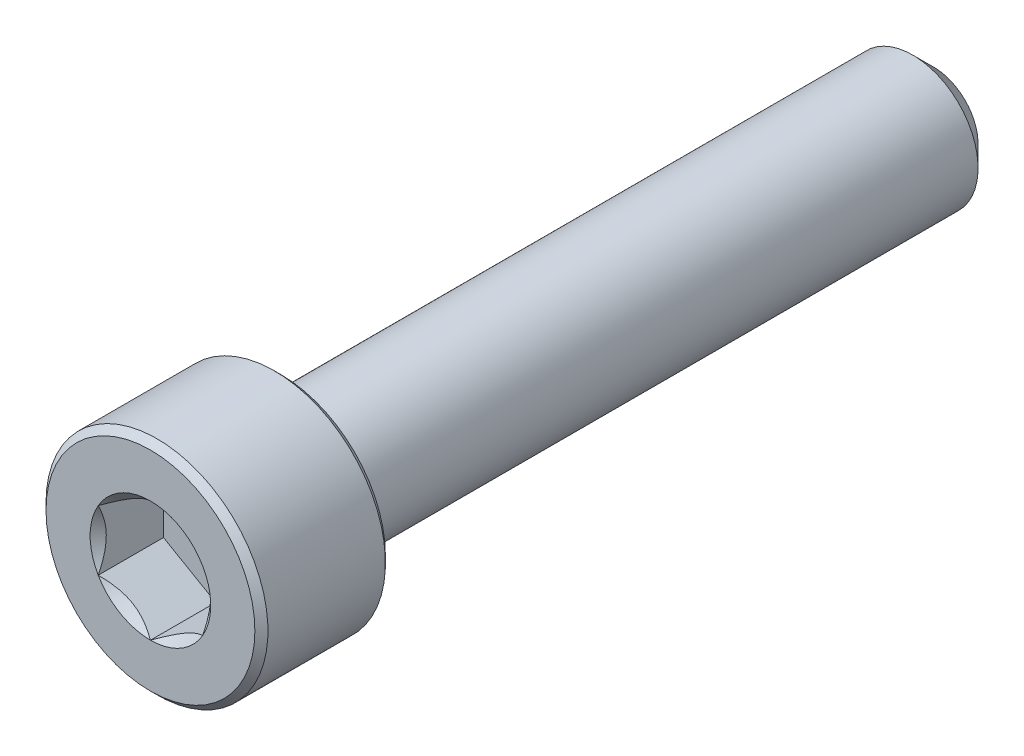
ISO-10303-21;
HEADER;
FILE_DESCRIPTION(('STEP AP214'),'2;1');
FILE_NAME('part.step','',(''),(''),'','','');
FILE_SCHEMA(('AUTOMOTIVE_DESIGN { 1 0 10303 214 1 1 1 1 }'));
ENDSEC;
DATA;
#1=APPLICATION_CONTEXT('core data for automotive mechanical design processes');
#2=APPLICATION_PROTOCOL_DEFINITION('international standard','automotive_design',2000,#1);
#3=PRODUCT_CONTEXT('',#1,'mechanical');
#4=PRODUCT('Part','Part','',(#3));
#5=PRODUCT_RELATED_PRODUCT_CATEGORY('part','',(#4));
#6=PRODUCT_DEFINITION_FORMATION('','',#4);
#7=PRODUCT_DEFINITION_CONTEXT('part definition',#1,'design');
#8=PRODUCT_DEFINITION('design','',#6,#7);
#9=PRODUCT_DEFINITION_SHAPE('','',#8);
#10=(LENGTH_UNIT() NAMED_UNIT(*) SI_UNIT(.MILLI.,.METRE.));
#11=(NAMED_UNIT(*) PLANE_ANGLE_UNIT() SI_UNIT($,.RADIAN.));
#12=(NAMED_UNIT(*) SI_UNIT($,.STERADIAN.) SOLID_ANGLE_UNIT());
#13=UNCERTAINTY_MEASURE_WITH_UNIT(LENGTH_MEASURE(1.E-05),#10,'distance_accuracy_value','');
#14=(GEOMETRIC_REPRESENTATION_CONTEXT(3) GLOBAL_UNCERTAINTY_ASSIGNED_CONTEXT((#13)) GLOBAL_UNIT_ASSIGNED_CONTEXT((#10,
#11,#12)) REPRESENTATION_CONTEXT('',''));
#15=CARTESIAN_POINT('',(0.,0.,0.));
#16=DIRECTION('',(0.,0.,1.));
#17=DIRECTION('',(1.,0.,0.));
#18=AXIS2_PLACEMENT_3D('',#15,#16,#17);
#19=CARTESIAN_POINT('',(0.,1.7,-15.));
#20=DIRECTION('',(0.,0.,-1.));
#21=DIRECTION('',(-1.,0.,0.));
#22=AXIS2_PLACEMENT_3D('',#19,#20,#21);
#23=PLANE('',#22);
#24=CARTESIAN_POINT('',(0.,0.,-15.));
#25=DIRECTION('',(0.,0.,-1.));
#26=DIRECTION('',(-1.,0.,0.));
#27=AXIS2_PLACEMENT_3D('',#24,#25,#26);
#28=CIRCLE('',#27,1.7);
#29=CARTESIAN_POINT('',(-1.7,0.,-15.));
#30=VERTEX_POINT('',#29);
#31=EDGE_CURVE('E42',#30,#30,#28,.T.);
#32=ORIENTED_EDGE('',*,*,#31,.T.);
#33=EDGE_LOOP('',(#32));
#34=FACE_BOUND('',#33,.T.);
#35=ADVANCED_FACE('F33',(#34),#23,.T.);
#36=CARTESIAN_POINT('',(0.,0.,-15.));
#37=DIRECTION('',(0.,0.,1.));
#38=DIRECTION('',(1.,0.,0.));
#39=AXIS2_PLACEMENT_3D('',#36,#37,#38);
#40=CONICAL_SURFACE('',#39,1.7,0.785398163397442);
#41=CARTESIAN_POINT('',(0.,0.,-14.2));
#42=DIRECTION('',(0.,0.,-1.));
#43=DIRECTION('',(-1.,0.,0.));
#44=AXIS2_PLACEMENT_3D('',#41,#42,#43);
#45=CIRCLE('',#44,2.5);
#46=CARTESIAN_POINT('',(-2.5,0.,-14.2));
#47=VERTEX_POINT('',#46);
#48=EDGE_CURVE('E12',#47,#47,#45,.T.);
#49=ORIENTED_EDGE('',*,*,#48,.T.);
#50=EDGE_LOOP('',(#49));
#51=FACE_BOUND('',#50,.T.);
#52=ORIENTED_EDGE('',*,*,#31,.F.);
#53=EDGE_LOOP('',(#52));
#54=FACE_BOUND('',#53,.T.);
#55=ADVANCED_FACE('F231',(#51,#54),#40,.T.);
#56=CARTESIAN_POINT('',(0.,0.,-15.));
#57=DIRECTION('',(0.,0.,-1.));
#58=DIRECTION('',(-1.,0.,0.));
#59=AXIS2_PLACEMENT_3D('',#56,#57,#58);
#60=CYLINDRICAL_SURFACE('',#59,2.5);
#61=CARTESIAN_POINT('',(0.,0.,10.));
#62=DIRECTION('',(0.,0.,-1.));
#63=DIRECTION('',(-1.,0.,0.));
#64=AXIS2_PLACEMENT_3D('',#61,#62,#63);
#65=CIRCLE('',#64,2.5);
#66=CARTESIAN_POINT('',(-2.5,0.,10.));
#67=VERTEX_POINT('',#66);
#68=EDGE_CURVE('E37',#67,#67,#65,.T.);
#69=ORIENTED_EDGE('',*,*,#68,.T.);
#70=EDGE_LOOP('',(#69));
#71=FACE_BOUND('',#70,.T.);
#72=ORIENTED_EDGE('',*,*,#48,.F.);
#73=EDGE_LOOP('',(#72));
#74=FACE_BOUND('',#73,.T.);
#75=ADVANCED_FACE('F35',(#71,#74),#60,.T.);
#76=CARTESIAN_POINT('',(-4.,0.,10.));
#77=DIRECTION('',(0.,0.,-1.));
#78=DIRECTION('',(-1.,0.,0.));
#79=AXIS2_PLACEMENT_3D('',#76,#77,#78);
#80=PLANE('',#79);
#81=ORIENTED_EDGE('',*,*,#68,.F.);
#82=EDGE_LOOP('',(#81));
#83=FACE_BOUND('',#82,.T.);
#84=CARTESIAN_POINT('',(0.,0.,10.));
#85=DIRECTION('',(0.,0.,-1.));
#86=DIRECTION('',(-1.,0.,0.));
#87=AXIS2_PLACEMENT_3D('',#84,#85,#86);
#88=CIRCLE('',#87,4.);
#89=CARTESIAN_POINT('',(-4.,0.,10.));
#90=VERTEX_POINT('',#89);
#91=EDGE_CURVE('E115',#90,#90,#88,.T.);
#92=ORIENTED_EDGE('',*,*,#91,.T.);
#93=EDGE_LOOP('',(#92));
#94=FACE_BOUND('',#93,.T.);
#95=ADVANCED_FACE('F143',(#83,#94),#80,.T.);
#96=CARTESIAN_POINT('',(0.,4.,15.));
#97=DIRECTION('',(0.,0.,1.));
#98=DIRECTION('',(1.,0.,0.));
#99=AXIS2_PLACEMENT_3D('',#96,#97,#98);
#100=PLANE('',#99);
#101=CARTESIAN_POINT('',(0.,0.,15.));
#102=DIRECTION('',(0.,0.,1.));
#103=DIRECTION('',(1.,0.,0.));
#104=AXIS2_PLACEMENT_3D('',#101,#102,#103);
#105=CIRCLE('',#104,2.3094010767585);
#106=CARTESIAN_POINT('',(2.,1.15470053837925,15.));
#107=VERTEX_POINT('',#106);
#108=CARTESIAN_POINT('',(0.,2.3094010767585,15.));
#109=VERTEX_POINT('',#108);
#110=EDGE_CURVE('E48',#107,#109,#105,.T.);
#111=ORIENTED_EDGE('',*,*,#110,.F.);
#112=CARTESIAN_POINT('',(2.,-1.15470053837925,15.));
#113=VERTEX_POINT('',#112);
#114=EDGE_CURVE('E90',#113,#107,#105,.T.);
#115=ORIENTED_EDGE('',*,*,#114,.F.);
#116=CARTESIAN_POINT('',(0.,-2.3094010767585,15.));
#117=VERTEX_POINT('',#116);
#118=EDGE_CURVE('E97',#117,#113,#105,.T.);
#119=ORIENTED_EDGE('',*,*,#118,.F.);
#120=CARTESIAN_POINT('',(-2.,-1.15470053837925,15.));
#121=VERTEX_POINT('',#120);
#122=EDGE_CURVE('E278',#121,#117,#105,.T.);
#123=ORIENTED_EDGE('',*,*,#122,.F.);
#124=CARTESIAN_POINT('',(-2.,1.15470053837925,15.));
#125=VERTEX_POINT('',#124);
#126=EDGE_CURVE('E124',#125,#121,#105,.T.);
#127=ORIENTED_EDGE('',*,*,#126,.F.);
#128=EDGE_CURVE('E122',#109,#125,#105,.T.);
#129=ORIENTED_EDGE('',*,*,#128,.F.);
#130=EDGE_LOOP('',(#111,#115,#119,#123,#127,#129));
#131=FACE_BOUND('',#130,.T.);
#132=CARTESIAN_POINT('',(0.,0.,15.));
#133=DIRECTION('',(0.,0.,-1.));
#134=DIRECTION('',(-1.,0.,0.));
#135=AXIS2_PLACEMENT_3D('',#132,#133,#134);
#136=CIRCLE('',#135,4.);
#137=CARTESIAN_POINT('',(-4.,0.,15.));
#138=VERTEX_POINT('',#137);
#139=EDGE_CURVE('E274',#138,#138,#136,.T.);
#140=ORIENTED_EDGE('',*,*,#139,.F.);
#141=EDGE_LOOP('',(#140));
#142=FACE_BOUND('',#141,.T.);
#143=ADVANCED_FACE('F118',(#131,#142),#100,.T.);
#144=CARTESIAN_POINT('',(0.,0.,14.75));
#145=DIRECTION('',(0.,0.,-1.));
#146=DIRECTION('',(-1.,0.,0.));
#147=AXIS2_PLACEMENT_3D('',#144,#145,#146);
#148=CONICAL_SURFACE('',#147,4.25,0.785398163397447);
#149=ORIENTED_EDGE('',*,*,#139,.T.);
#150=EDGE_LOOP('',(#149));
#151=FACE_BOUND('',#150,.T.);
#152=CARTESIAN_POINT('',(0.,0.,14.75));
#153=DIRECTION('',(0.,0.,-1.));
#154=DIRECTION('',(-1.,0.,0.));
#155=AXIS2_PLACEMENT_3D('',#152,#153,#154);
#156=CIRCLE('',#155,4.25);
#157=CARTESIAN_POINT('',(-4.25,0.,14.75));
#158=VERTEX_POINT('',#157);
#159=EDGE_CURVE('E153',#158,#158,#156,.T.);
#160=ORIENTED_EDGE('',*,*,#159,.F.);
#161=EDGE_LOOP('',(#160));
#162=FACE_BOUND('',#161,.T.);
#163=ADVANCED_FACE('F244',(#151,#162),#148,.T.);
#164=CARTESIAN_POINT('',(0.,0.,-15.));
#165=DIRECTION('',(0.,0.,-1.));
#166=DIRECTION('',(-1.,0.,0.));
#167=AXIS2_PLACEMENT_3D('',#164,#165,#166);
#168=CYLINDRICAL_SURFACE('',#167,4.25);
#169=ORIENTED_EDGE('',*,*,#159,.T.);
#170=EDGE_LOOP('',(#169));
#171=FACE_BOUND('',#170,.T.);
#172=CARTESIAN_POINT('',(0.,0.,10.25));
#173=DIRECTION('',(0.,0.,-1.));
#174=DIRECTION('',(-1.,0.,0.));
#175=AXIS2_PLACEMENT_3D('',#172,#173,#174);
#176=CIRCLE('',#175,4.25);
#177=CARTESIAN_POINT('',(-4.25,0.,10.25));
#178=VERTEX_POINT('',#177);
#179=EDGE_CURVE('E150',#178,#178,#176,.T.);
#180=ORIENTED_EDGE('',*,*,#179,.F.);
#181=EDGE_LOOP('',(#180));
#182=FACE_BOUND('',#181,.T.);
#183=ADVANCED_FACE('F249',(#171,#182),#168,.T.);
#184=CARTESIAN_POINT('',(0.,0.,10.));
#185=DIRECTION('',(0.,0.,1.));
#186=DIRECTION('',(1.,0.,0.));
#187=AXIS2_PLACEMENT_3D('',#184,#185,#186);
#188=CONICAL_SURFACE('',#187,4.,0.785398163397452);
#189=ORIENTED_EDGE('',*,*,#179,.T.);
#190=EDGE_LOOP('',(#189));
#191=FACE_BOUND('',#190,.T.);
#192=ORIENTED_EDGE('',*,*,#91,.F.);
#193=EDGE_LOOP('',(#192));
#194=FACE_BOUND('',#193,.T.);
#195=ADVANCED_FACE('F254',(#191,#194),#188,.T.);
#196=CARTESIAN_POINT('',(0.,0.,15.));
#197=DIRECTION('',(0.,0.,1.));
#198=DIRECTION('',(1.,0.,0.));
#199=AXIS2_PLACEMENT_3D('',#196,#197,#198);
#200=CONICAL_SURFACE('',#199,2.3094010767585,0.78539816339745);
#201=ORIENTED_EDGE('',*,*,#128,.T.);
#202=CARTESIAN_POINT('',(0.000200000000000219,2.30951654681234,15.0001154787137));
#203=CARTESIAN_POINT('',(-0.0685530340307049,2.26982196410711,14.9604530902256));
#204=CARTESIAN_POINT('',(-0.138455742135511,2.22946361676572,14.9231199822842));
#205=CARTESIAN_POINT('',(-0.280995244550436,2.14716839667631,14.8547636851361));
#206=CARTESIAN_POINT('',(-0.353645597565358,2.10522369580642,14.8237785337372));
#207=CARTESIAN_POINT('',(-0.500141601053971,2.02064418875706,14.7707002165441));
#208=CARTESIAN_POINT('',(-0.573949935246294,1.97803092714269,14.7484736271766));
#209=CARTESIAN_POINT('',(-0.723191631835264,1.89186619344273,14.7142288166751));
#210=CARTESIAN_POINT('',(-0.798620433918152,1.84831735425552,14.7021850291441));
#211=CARTESIAN_POINT('',(-0.928615500671079,1.7732646674724,14.6913185119056));
#212=CARTESIAN_POINT('',(-0.983013783970109,1.74185780396625,14.68970975361));
#213=CARTESIAN_POINT('',(-1.09172145551969,1.67909540053412,14.6924188775987));
#214=CARTESIAN_POINT('',(-1.14603080592134,1.64773988246022,14.696738837758));
#215=CARTESIAN_POINT('',(-1.25413672758934,1.5853248994842,14.7110595674099));
#216=CARTESIAN_POINT('',(-1.30793265655479,1.55426580541469,14.721066692762));
#217=CARTESIAN_POINT('',(-1.41459426230557,1.49268469862228,14.7462124302497));
#218=CARTESIAN_POINT('',(-1.46746001007071,1.46216264491917,14.7613506490422));
#219=CARTESIAN_POINT('',(-1.60287973308984,1.38397803138049,14.8062945034292));
#220=CARTESIAN_POINT('',(-1.68459383484948,1.33680037273297,14.8394888394258));
#221=CARTESIAN_POINT('',(-1.8047470372578,1.26742988897853,14.8955258231714));
#222=CARTESIAN_POINT('',(-1.84434285210918,1.24456923461531,14.9152147029469));
#223=CARTESIAN_POINT('',(-1.92280095888787,1.19927142554652,14.9563873183649));
#224=CARTESIAN_POINT('',(-1.96166368359374,1.17683402097614,14.9778699516512));
#225=CARTESIAN_POINT('',(-2.0002,1.15458506832541,15.0001154787137));
#226=B_SPLINE_CURVE_WITH_KNOTS('',3,(#202,#203,#204,#205,#206,#207,#208,#209,#210,#211,#212,
#213,#214,#215,#216,#217,#218,#219,#220,#221,#222,#223,#224,#225),.UNSPECIFIED.,.F.,.F.,(4,2,2,
2,2,2,2,2,2,2,2,4),(0.,0.266420613771063,0.534393751523388,0.798110374376914,1.06116288956936,
1.24939906803722,1.43770123566247,1.62621426093932,1.81471283831913,2.11415604834145,
2.26347170717791,2.41269626969771),.UNSPECIFIED.);
#227=EDGE_CURVE('E203',#109,#125,#226,.T.);
#228=ORIENTED_EDGE('',*,*,#227,.F.);
#229=EDGE_LOOP('',(#201,#228));
#230=FACE_BOUND('',#229,.T.);
#231=ADVANCED_FACE('F198',(#230),#200,.F.);
#232=ORIENTED_EDGE('',*,*,#126,.T.);
#233=CARTESIAN_POINT('',(-2.,-2.33350792809314,15.7639129733303));
#234=CARTESIAN_POINT('',(-2.,-2.27682524005105,15.7208846581945));
#235=CARTESIAN_POINT('',(-2.,-2.21982863127678,15.6782632196867));
#236=CARTESIAN_POINT('',(-2.,-2.10508243227164,15.5940173538232));
#237=CARTESIAN_POINT('',(-2.,-2.04733265969732,15.5523931750969));
#238=CARTESIAN_POINT('',(-2.,-1.9305325076875,15.4700289390981));
#239=CARTESIAN_POINT('',(-2.,-1.87147552066419,15.429298220564));
#240=CARTESIAN_POINT('',(-2.,-1.75236453496771,15.3493264895712));
#241=CARTESIAN_POINT('',(-2.,-1.69231060660119,15.3100853726983));
#242=CARTESIAN_POINT('',(-2.,-1.567471533448,15.231167878885));
#243=CARTESIAN_POINT('',(-2.,-1.50261611656329,15.1916021023748));
#244=CARTESIAN_POINT('',(-2.,-1.37138716901082,15.1150292158728));
#245=CARTESIAN_POINT('',(-2.,-1.30501336962871,15.078022563515));
#246=CARTESIAN_POINT('',(-2.,-1.17075263037878,15.0073667392341));
#247=CARTESIAN_POINT('',(-2.,-1.10287104348427,14.9737074751461));
#248=CARTESIAN_POINT('',(-2.,-0.96522809254686,14.9104931511267));
#249=CARTESIAN_POINT('',(-2.,-0.895467367515904,14.880936716527));
#250=CARTESIAN_POINT('',(-2.,-0.760038155655725,14.8293102578544));
#251=CARTESIAN_POINT('',(-2.,-0.694533426178474,14.8068150810793));
#252=CARTESIAN_POINT('',(-2.,-0.561920164972266,14.767075888443));
#253=CARTESIAN_POINT('',(-2.,-0.494811525645963,14.7498322259491));
#254=CARTESIAN_POINT('',(-2.,-0.360522211095495,14.7217927565028));
#255=CARTESIAN_POINT('',(-2.,-0.293365389163158,14.7108845882273));
#256=CARTESIAN_POINT('',(-2.,-0.158300090029279,14.6957327026119));
#257=CARTESIAN_POINT('',(-2.,-0.0903917516002773,14.6914877748764));
#258=CARTESIAN_POINT('',(-2.,0.0429020652606309,14.6899911421531));
#259=CARTESIAN_POINT('',(-2.,0.108284684169079,14.6924781450741));
#260=CARTESIAN_POINT('',(-2.,0.23850440969295,14.7037243932026));
#261=CARTESIAN_POINT('',(-2.,0.303341463641695,14.7124842370936));
#262=CARTESIAN_POINT('',(-2.,0.433098840648744,14.7359415229804));
#263=CARTESIAN_POINT('',(-2.,0.498000415627631,14.7507410846435));
#264=CARTESIAN_POINT('',(-2.,0.626381661351717,14.7854820388306));
#265=CARTESIAN_POINT('',(-2.,0.689861439952175,14.8054230398874));
#266=CARTESIAN_POINT('',(-2.,0.888345745687483,14.8753121453604));
#267=CARTESIAN_POINT('',(-2.,1.02055912670982,14.9331624710628));
#268=CARTESIAN_POINT('',(-2.,1.27879697777602,15.0618231959499));
#269=CARTESIAN_POINT('',(-2.,1.40479723810913,15.1326798810734));
#270=CARTESIAN_POINT('',(-2.,1.58692013279987,15.2432796363255));
#271=CARTESIAN_POINT('',(-2.,1.64501521895223,15.2798382435255));
#272=CARTESIAN_POINT('',(-2.,1.76020814703229,15.3545059144978));
#273=CARTESIAN_POINT('',(-2.,1.81730591318335,15.3926150953569));
#274=CARTESIAN_POINT('',(-2.,1.93017247334117,15.4697864647308));
#275=CARTESIAN_POINT('',(-2.,1.98594828328331,15.5088384434598));
#276=CARTESIAN_POINT('',(-2.,2.09673667795809,15.5879797964898));
#277=CARTESIAN_POINT('',(-2.,2.15174946854703,15.6280688822828));
#278=CARTESIAN_POINT('',(-2.,2.20644261038878,15.6685829717111));
#279=B_SPLINE_CURVE_WITH_KNOTS('',3,(#233,#234,#235,#236,#237,#238,#239,#240,#241,#242,#243,
#244,#245,#246,#247,#248,#249,#250,#251,#252,#253,#254,#255,#256,#257,#258,#259,#260,#261,#262,
#263,#264,#265,#266,#267,#268,#269,#270,#271,#272,#273,#274,#275,#276,#277,#278),.UNSPECIFIED.,
.F.,.F.,(4,2,2,2,2,2,2,2,2,2,2,2,2,2,2,2,2,2,2,2,2,2,4),(0.,0.213497148294752,0.427046981593393,
0.642249974749848,0.857437855216921,1.08530552050929,1.31321382930987,1.54041273599371,
1.76753533413947,1.97513287362836,2.18274437898411,2.38655158594355,2.59032176649044,
2.78629737352115,2.98229168707252,3.18174703964799,3.38118721025193,3.81287365989454,
4.24612724012856,4.45203046308783,4.65794926316182,4.86220142187746,5.06639735899165),.UNSPECIFIED.);
#280=EDGE_CURVE('E123',#125,#121,#279,.F.);
#281=ORIENTED_EDGE('',*,*,#280,.F.);
#282=EDGE_LOOP('',(#232,#281));
#283=FACE_BOUND('',#282,.T.);
#284=ADVANCED_FACE('F261',(#283),#200,.F.);
#285=ORIENTED_EDGE('',*,*,#122,.T.);
#286=CARTESIAN_POINT('',(-2.0002,-1.15458506832541,15.0001154787137));
#287=CARTESIAN_POINT('',(-1.93144696596929,-1.19427965103065,14.9604530902256));
#288=CARTESIAN_POINT('',(-1.86154425786449,-1.23463799837204,14.9231199822842));
#289=CARTESIAN_POINT('',(-1.71900475544956,-1.31693321846145,14.8547636851361));
#290=CARTESIAN_POINT('',(-1.64635440243464,-1.35887791933134,14.8237785337372));
#291=CARTESIAN_POINT('',(-1.49985839894603,-1.44345742638069,14.7707002165441));
#292=CARTESIAN_POINT('',(-1.42605006475371,-1.48607068799507,14.7484736271766));
#293=CARTESIAN_POINT('',(-1.27680836816474,-1.57223542169503,14.7142288166751));
#294=CARTESIAN_POINT('',(-1.20137956608185,-1.61578426088223,14.7021850291441));
#295=CARTESIAN_POINT('',(-1.07138449932892,-1.69083694766536,14.6913185119056));
#296=CARTESIAN_POINT('',(-1.01698621602989,-1.72224381117151,14.68970975361));
#297=CARTESIAN_POINT('',(-0.908278544480307,-1.78500621460364,14.6924188775987));
#298=CARTESIAN_POINT('',(-0.853969194078662,-1.81636173267754,14.696738837758));
#299=CARTESIAN_POINT('',(-0.745863272410663,-1.87877671565355,14.7110595674099));
#300=CARTESIAN_POINT('',(-0.692067343445209,-1.90983580972306,14.721066692762));
#301=CARTESIAN_POINT('',(-0.585405737694427,-1.97141691651547,14.7462124302497));
#302=CARTESIAN_POINT('',(-0.532539989929288,-2.00193897021859,14.7613506490422));
#303=CARTESIAN_POINT('',(-0.397120266910157,-2.08012358375727,14.8062945034292));
#304=CARTESIAN_POINT('',(-0.315406165150523,-2.12730124240478,14.8394888394258));
#305=CARTESIAN_POINT('',(-0.195252962742199,-2.19667172615922,14.8955258231714));
#306=CARTESIAN_POINT('',(-0.155657147890825,-2.21953238052245,14.9152147029469));
#307=CARTESIAN_POINT('',(-0.0771990411121298,-2.26483018959124,14.9563873183649));
#308=CARTESIAN_POINT('',(-0.0383363164062618,-2.28726759416161,14.9778699516512));
#309=CARTESIAN_POINT('',(0.000199999999997879,-2.30951654681234,15.0001154787137));
#310=B_SPLINE_CURVE_WITH_KNOTS('',3,(#286,#287,#288,#289,#290,#291,#292,#293,#294,#295,#296,
#297,#298,#299,#300,#301,#302,#303,#304,#305,#306,#307,#308,#309),.UNSPECIFIED.,.F.,.F.,(4,2,2,
2,2,2,2,2,2,2,2,4),(0.,0.266420613771064,0.534393751523388,0.798110374376913,1.06116288956936,
1.24939906803722,1.43770123566247,1.62621426093931,1.81471283831913,2.11415604834144,
2.2634717071779,2.4126962696977),.UNSPECIFIED.);
#311=EDGE_CURVE('E126',#121,#117,#310,.T.);
#312=ORIENTED_EDGE('',*,*,#311,.F.);
#313=EDGE_LOOP('',(#285,#312));
#314=FACE_BOUND('',#313,.T.);
#315=ADVANCED_FACE('F268',(#314),#200,.F.);
#316=ORIENTED_EDGE('',*,*,#118,.T.);
#317=CARTESIAN_POINT('',(-0.000200000000001455,-2.30951654681234,15.0001154787137));
#318=CARTESIAN_POINT('',(0.0685530340307037,-2.26982196410711,14.9604530902256));
#319=CARTESIAN_POINT('',(0.13845574213551,-2.22946361676572,14.9231199822842));
#320=CARTESIAN_POINT('',(0.280995244550434,-2.1471683966763,14.8547636851361));
#321=CARTESIAN_POINT('',(0.353645597565357,-2.10522369580642,14.8237785337372));
#322=CARTESIAN_POINT('',(0.50014160105397,-2.02064418875706,14.7707002165441));
#323=CARTESIAN_POINT('',(0.573949935246293,-1.97803092714269,14.7484736271766));
#324=CARTESIAN_POINT('',(0.723191631835263,-1.89186619344273,14.7142288166751));
#325=CARTESIAN_POINT('',(0.798620433918151,-1.84831735425552,14.7021850291441));
#326=CARTESIAN_POINT('',(0.928615500671078,-1.7732646674724,14.6913185119056));
#327=CARTESIAN_POINT('',(0.983013783970108,-1.74185780396625,14.68970975361));
#328=CARTESIAN_POINT('',(1.09172145551969,-1.67909540053412,14.6924188775987));
#329=CARTESIAN_POINT('',(1.14603080592134,-1.64773988246021,14.696738837758));
#330=CARTESIAN_POINT('',(1.25413672758934,-1.5853248994842,14.7110595674099));
#331=CARTESIAN_POINT('',(1.30793265655479,-1.55426580541469,14.721066692762));
#332=CARTESIAN_POINT('',(1.41459426230557,-1.49268469862228,14.7462124302497));
#333=CARTESIAN_POINT('',(1.46746001007071,-1.46216264491917,14.7613506490422));
#334=CARTESIAN_POINT('',(1.60287973308984,-1.38397803138049,14.8062945034292));
#335=CARTESIAN_POINT('',(1.68459383484948,-1.33680037273297,14.8394888394258));
#336=CARTESIAN_POINT('',(1.8047470372578,-1.26742988897853,14.8955258231714));
#337=CARTESIAN_POINT('',(1.84434285210918,-1.24456923461531,14.9152147029469));
#338=CARTESIAN_POINT('',(1.92280095888787,-1.19927142554652,14.9563873183649));
#339=CARTESIAN_POINT('',(1.96166368359374,-1.17683402097614,14.9778699516512));
#340=CARTESIAN_POINT('',(2.0002,-1.15458506832541,15.0001154787137));
#341=B_SPLINE_CURVE_WITH_KNOTS('',3,(#317,#318,#319,#320,#321,#322,#323,#324,#325,#326,#327,
#328,#329,#330,#331,#332,#333,#334,#335,#336,#337,#338,#339,#340),.UNSPECIFIED.,.F.,.F.,(4,2,2,
2,2,2,2,2,2,2,2,4),(0.,0.266420613771063,0.534393751523388,0.798110374376914,1.06116288956936,
1.24939906803722,1.43770123566247,1.62621426093932,1.81471283831913,2.11415604834145,
2.2634717071779,2.41269626969771),.UNSPECIFIED.);
#342=EDGE_CURVE('E110',#117,#113,#341,.T.);
#343=ORIENTED_EDGE('',*,*,#342,.F.);
#344=EDGE_LOOP('',(#316,#343));
#345=FACE_BOUND('',#344,.T.);
#346=ADVANCED_FACE('F283',(#345),#200,.F.);
#347=ORIENTED_EDGE('',*,*,#114,.T.);
#348=CARTESIAN_POINT('',(2.,-2.3335079282084,15.7639129734179));
#349=CARTESIAN_POINT('',(2.,-2.27682524016306,15.7208846582787));
#350=CARTESIAN_POINT('',(2.,-2.21982863138551,15.6782632197674));
#351=CARTESIAN_POINT('',(2.,-2.1050824323738,15.5940173538972));
#352=CARTESIAN_POINT('',(2.,-2.04733265979617,15.5523931751676));
#353=CARTESIAN_POINT('',(2.,-1.93053250777963,15.4700289391621));
#354=CARTESIAN_POINT('',(2.,-1.87147552075291,15.4292982206246));
#355=CARTESIAN_POINT('',(2.,-1.75236453504953,15.3493264896251));
#356=CARTESIAN_POINT('',(2.,-1.69231060667954,15.3100853727489));
#357=CARTESIAN_POINT('',(2.,-1.56747153351884,15.2311678789286));
#358=CARTESIAN_POINT('',(2.,-1.5026161166301,15.1916021024149));
#359=CARTESIAN_POINT('',(2.,-1.37138716906942,15.1150292159059));
#360=CARTESIAN_POINT('',(2.,-1.30501336968313,15.0780225635447));
#361=CARTESIAN_POINT('',(2.,-1.17075263042469,15.0073667392572));
#362=CARTESIAN_POINT('',(2.,-1.10287104352586,14.9737074751661));
#363=CARTESIAN_POINT('',(2.,-0.96522809257956,14.9104931511408));
#364=CARTESIAN_POINT('',(2.,-0.895467367544043,14.8809367165384));
#365=CARTESIAN_POINT('',(2.,-0.760038155681912,14.8293102578637));
#366=CARTESIAN_POINT('',(2.,-0.694533426207471,14.8068150810889));
#367=CARTESIAN_POINT('',(2.,-0.561920165006982,14.7670758884525));
#368=CARTESIAN_POINT('',(2.,-0.494811525683585,14.7498322259582));
#369=CARTESIAN_POINT('',(2.,-0.360522211138837,14.7217927565106));
#370=CARTESIAN_POINT('',(2.,-0.293365389209313,14.7108845882341));
#371=CARTESIAN_POINT('',(2.,-0.15830009008097,14.6957327026161));
#372=CARTESIAN_POINT('',(2.,-0.0903917516546917,14.691487774879));
#373=CARTESIAN_POINT('',(2.,0.0429020652013074,14.6899911421519));
#374=CARTESIAN_POINT('',(2.,0.108284684107562,14.6924781450708));
#375=CARTESIAN_POINT('',(2.,0.238504409627275,14.7037243931948));
#376=CARTESIAN_POINT('',(2.,0.303341463574055,14.7124842370835));
#377=CARTESIAN_POINT('',(2.,0.433098840577222,14.7359415229653));
#378=CARTESIAN_POINT('',(2.,0.4980004155542,14.7507410846258));
#379=CARTESIAN_POINT('',(2.,0.626381661274658,14.7854820388076));
#380=CARTESIAN_POINT('',(2.,0.689861439873397,14.8054230398617));
#381=CARTESIAN_POINT('',(2.,0.888345745591677,14.8753121453222));
#382=CARTESIAN_POINT('',(2.,1.02055912659956,14.9331624710131));
#383=CARTESIAN_POINT('',(2.,1.27879697763796,15.0618231958759));
#384=CARTESIAN_POINT('',(2.,1.40479723795773,15.1326798809865));
#385=CARTESIAN_POINT('',(2.,1.58692013262996,15.2432796362199));
#386=CARTESIAN_POINT('',(2.,1.64501521877692,15.2798382434142));
#387=CARTESIAN_POINT('',(2.,1.76020814684622,15.3545059143749));
#388=CARTESIAN_POINT('',(2.,1.81730591299196,15.3926150952282));
#389=CARTESIAN_POINT('',(2.,1.93017247313923,15.4697864645906));
#390=CARTESIAN_POINT('',(2.,1.98594828307617,15.5088384433139));
#391=CARTESIAN_POINT('',(2.,2.09673667774057,15.5879797963324));
#392=CARTESIAN_POINT('',(2.,2.15174946832435,15.6280688821197));
#393=CARTESIAN_POINT('',(2.,2.20644261016092,15.6685829715422));
#394=B_SPLINE_CURVE_WITH_KNOTS('',3,(#348,#349,#350,#351,#352,#353,#354,#355,#356,#357,#358,
#359,#360,#361,#362,#363,#364,#365,#366,#367,#368,#369,#370,#371,#372,#373,#374,#375,#376,#377,
#378,#379,#380,#381,#382,#383,#384,#385,#386,#387,#388,#389,#390,#391,#392,#393),.UNSPECIFIED.,
.F.,.F.,(4,2,2,2,2,2,2,2,2,2,2,2,2,2,2,2,2,2,2,2,2,2,4),(0.,0.213497148308672,0.427046981621234,
0.642249974791874,0.857437855273128,1.08530552058142,1.31321382939793,1.54041273609756,
1.76753533425909,1.97513287373982,2.18274437908743,2.38655158603907,2.59032176657815,
2.78629737360208,2.98229168714667,3.18174703971481,3.38118721031143,3.81287365990069,
4.24612724008101,4.45203046301732,4.65794926306836,4.86220142176135,5.06639735885289),.UNSPECIFIED.);
#395=EDGE_CURVE('E93',#113,#107,#394,.T.);
#396=ORIENTED_EDGE('',*,*,#395,.F.);
#397=EDGE_LOOP('',(#347,#396));
#398=FACE_BOUND('',#397,.T.);
#399=ADVANCED_FACE('F91',(#398),#200,.F.);
#400=ORIENTED_EDGE('',*,*,#110,.T.);
#401=CARTESIAN_POINT('',(2.0002,1.15458506832542,15.0001154787137));
#402=CARTESIAN_POINT('',(1.93144696596929,1.19427965103065,14.9604530902256));
#403=CARTESIAN_POINT('',(1.86154425786449,1.23463799837204,14.9231199822842));
#404=CARTESIAN_POINT('',(1.71900475544956,1.31693321846145,14.8547636851361));
#405=CARTESIAN_POINT('',(1.64635440243464,1.35887791933134,14.8237785337372));
#406=CARTESIAN_POINT('',(1.49985839894603,1.44345742638069,14.7707002165441));
#407=CARTESIAN_POINT('',(1.42605006475371,1.48607068799507,14.7484736271766));
#408=CARTESIAN_POINT('',(1.27680836816474,1.57223542169503,14.7142288166751));
#409=CARTESIAN_POINT('',(1.20137956608185,1.61578426088223,14.7021850291441));
#410=CARTESIAN_POINT('',(1.07138449932892,1.69083694766536,14.6913185119056));
#411=CARTESIAN_POINT('',(1.01698621602989,1.72224381117151,14.68970975361));
#412=CARTESIAN_POINT('',(0.908278544480307,1.78500621460364,14.6924188775987));
#413=CARTESIAN_POINT('',(0.853969194078662,1.81636173267754,14.696738837758));
#414=CARTESIAN_POINT('',(0.745863272410663,1.87877671565355,14.7110595674099));
#415=CARTESIAN_POINT('',(0.692067343445209,1.90983580972306,14.721066692762));
#416=CARTESIAN_POINT('',(0.585405737694427,1.97141691651547,14.7462124302497));
#417=CARTESIAN_POINT('',(0.532539989929288,2.00193897021859,14.7613506490422));
#418=CARTESIAN_POINT('',(0.397120266910156,2.08012358375727,14.8062945034292));
#419=CARTESIAN_POINT('',(0.315406165150521,2.12730124240478,14.8394888394258));
#420=CARTESIAN_POINT('',(0.195252962742197,2.19667172615922,14.8955258231714));
#421=CARTESIAN_POINT('',(0.155657147890822,2.21953238052245,14.9152147029469));
#422=CARTESIAN_POINT('',(0.0771990411121273,2.26483018959124,14.9563873183649));
#423=CARTESIAN_POINT('',(0.0383363164062593,2.28726759416161,14.9778699516512));
#424=CARTESIAN_POINT('',(-0.000200000000000176,2.30951654681234,15.0001154787137));
#425=B_SPLINE_CURVE_WITH_KNOTS('',3,(#401,#402,#403,#404,#405,#406,#407,#408,#409,#410,#411,
#412,#413,#414,#415,#416,#417,#418,#419,#420,#421,#422,#423,#424),.UNSPECIFIED.,.F.,.F.,(4,2,2,
2,2,2,2,2,2,2,2,4),(0.,0.266420613771063,0.534393751523387,0.798110374376912,1.06116288956936,
1.24939906803721,1.43770123566247,1.62621426093931,1.81471283831913,2.11415604834145,
2.2634717071779,2.41269626969771),.UNSPECIFIED.);
#426=EDGE_CURVE('E99',#107,#109,#425,.T.);
#427=ORIENTED_EDGE('',*,*,#426,.F.);
#428=EDGE_LOOP('',(#400,#427));
#429=FACE_BOUND('',#428,.T.);
#430=ADVANCED_FACE('F100',(#429),#200,.F.);
#431=CARTESIAN_POINT('',(0.,0.,12.5));
#432=DIRECTION('',(0.,0.,1.));
#433=DIRECTION('',(1.,0.,0.));
#434=AXIS2_PLACEMENT_3D('',#431,#432,#433);
#435=PLANE('',#434);
#436=DIRECTION('',(-0.866025403784439,0.5,0.));
#437=VECTOR('',#436,1.);
#438=CARTESIAN_POINT('',(2.,1.15470053837925,12.5));
#439=LINE('',#438,#437);
#440=CARTESIAN_POINT('',(2.,1.15470053837925,12.5));
#441=VERTEX_POINT('',#440);
#442=CARTESIAN_POINT('',(0.,2.3094010767585,12.5));
#443=VERTEX_POINT('',#442);
#444=EDGE_CURVE('E102',#441,#443,#439,.T.);
#445=ORIENTED_EDGE('',*,*,#444,.T.);
#446=DIRECTION('',(-0.866025403784439,-0.5,0.));
#447=VECTOR('',#446,1.);
#448=CARTESIAN_POINT('',(0.,2.3094010767585,12.5));
#449=LINE('',#448,#447);
#450=CARTESIAN_POINT('',(-2.,1.15470053837925,12.5));
#451=VERTEX_POINT('',#450);
#452=EDGE_CURVE('E179',#443,#451,#449,.T.);
#453=ORIENTED_EDGE('',*,*,#452,.T.);
#454=DIRECTION('',(0.,-1.,0.));
#455=VECTOR('',#454,1.);
#456=CARTESIAN_POINT('',(-2.,1.15470053837925,12.5));
#457=LINE('',#456,#455);
#458=CARTESIAN_POINT('',(-2.,-1.15470053837925,12.5));
#459=VERTEX_POINT('',#458);
#460=EDGE_CURVE('E176',#451,#459,#457,.T.);
#461=ORIENTED_EDGE('',*,*,#460,.T.);
#462=DIRECTION('',(0.866025403784439,-0.5,0.));
#463=VECTOR('',#462,1.);
#464=CARTESIAN_POINT('',(-2.,-1.15470053837925,12.5));
#465=LINE('',#464,#463);
#466=CARTESIAN_POINT('',(0.,-2.3094010767585,12.5));
#467=VERTEX_POINT('',#466);
#468=EDGE_CURVE('E173',#459,#467,#465,.T.);
#469=ORIENTED_EDGE('',*,*,#468,.T.);
#470=DIRECTION('',(0.866025403784439,0.5,0.));
#471=VECTOR('',#470,1.);
#472=CARTESIAN_POINT('',(0.,-2.3094010767585,12.5));
#473=LINE('',#472,#471);
#474=CARTESIAN_POINT('',(2.,-1.15470053837925,12.5));
#475=VERTEX_POINT('',#474);
#476=EDGE_CURVE('E170',#467,#475,#473,.T.);
#477=ORIENTED_EDGE('',*,*,#476,.T.);
#478=DIRECTION('',(0.,1.,0.));
#479=VECTOR('',#478,1.);
#480=CARTESIAN_POINT('',(2.,-1.15470053837925,12.5));
#481=LINE('',#480,#479);
#482=EDGE_CURVE('E158',#475,#441,#481,.T.);
#483=ORIENTED_EDGE('',*,*,#482,.T.);
#484=EDGE_LOOP('',(#445,#453,#461,#469,#477,#483));
#485=FACE_BOUND('',#484,.T.);
#486=ADVANCED_FACE('F197',(#485),#435,.T.);
#487=CARTESIAN_POINT('',(0.,2.3094010767585,12.5));
#488=DIRECTION('',(-0.5,0.866025403784439,0.));
#489=DIRECTION('',(-0.866025403784439,-0.5,0.));
#490=AXIS2_PLACEMENT_3D('',#487,#488,#489);
#491=PLANE('',#490);
#492=DIRECTION('',(0.,0.,1.));
#493=VECTOR('',#492,1.);
#494=CARTESIAN_POINT('',(0.,2.3094010767585,12.5));
#495=LINE('',#494,#493);
#496=EDGE_CURVE('E56',#443,#109,#495,.T.);
#497=ORIENTED_EDGE('',*,*,#496,.T.);
#498=ORIENTED_EDGE('',*,*,#227,.T.);
#499=DIRECTION('',(0.,0.,1.));
#500=VECTOR('',#499,1.);
#501=CARTESIAN_POINT('',(-2.,1.15470053837925,12.5));
#502=LINE('',#501,#500);
#503=EDGE_CURVE('E159',#451,#125,#502,.T.);
#504=ORIENTED_EDGE('',*,*,#503,.F.);
#505=ORIENTED_EDGE('',*,*,#452,.F.);
#506=EDGE_LOOP('',(#497,#498,#504,#505));
#507=FACE_BOUND('',#506,.T.);
#508=ADVANCED_FACE('F272',(#507),#491,.F.);
#509=CARTESIAN_POINT('',(-2.,1.15470053837925,12.5));
#510=DIRECTION('',(-1.,0.,0.));
#511=DIRECTION('',(0.,-1.,0.));
#512=AXIS2_PLACEMENT_3D('',#509,#510,#511);
#513=PLANE('',#512);
#514=ORIENTED_EDGE('',*,*,#503,.T.);
#515=ORIENTED_EDGE('',*,*,#280,.T.);
#516=DIRECTION('',(0.,0.,1.));
#517=VECTOR('',#516,1.);
#518=CARTESIAN_POINT('',(-2.,-1.15470053837925,12.5));
#519=LINE('',#518,#517);
#520=EDGE_CURVE('E162',#459,#121,#519,.T.);
#521=ORIENTED_EDGE('',*,*,#520,.F.);
#522=ORIENTED_EDGE('',*,*,#460,.F.);
#523=EDGE_LOOP('',(#514,#515,#521,#522));
#524=FACE_BOUND('',#523,.T.);
#525=ADVANCED_FACE('F276',(#524),#513,.F.);
#526=CARTESIAN_POINT('',(-2.,-1.15470053837925,12.5));
#527=DIRECTION('',(-0.5,-0.866025403784438,0.));
#528=DIRECTION('',(0.866025403784439,-0.5,0.));
#529=AXIS2_PLACEMENT_3D('',#526,#527,#528);
#530=PLANE('',#529);
#531=ORIENTED_EDGE('',*,*,#520,.T.);
#532=ORIENTED_EDGE('',*,*,#311,.T.);
#533=DIRECTION('',(0.,0.,1.));
#534=VECTOR('',#533,1.);
#535=CARTESIAN_POINT('',(0.,-2.3094010767585,12.5));
#536=LINE('',#535,#534);
#537=EDGE_CURVE('E165',#467,#117,#536,.T.);
#538=ORIENTED_EDGE('',*,*,#537,.F.);
#539=ORIENTED_EDGE('',*,*,#468,.F.);
#540=EDGE_LOOP('',(#531,#532,#538,#539));
#541=FACE_BOUND('',#540,.T.);
#542=ADVANCED_FACE('F222',(#541),#530,.F.);
#543=CARTESIAN_POINT('',(0.,-2.3094010767585,12.5));
#544=DIRECTION('',(0.5,-0.866025403784439,0.));
#545=DIRECTION('',(0.866025403784439,0.5,0.));
#546=AXIS2_PLACEMENT_3D('',#543,#544,#545);
#547=PLANE('',#546);
#548=ORIENTED_EDGE('',*,*,#537,.T.);
#549=ORIENTED_EDGE('',*,*,#342,.T.);
#550=DIRECTION('',(0.,0.,1.));
#551=VECTOR('',#550,1.);
#552=CARTESIAN_POINT('',(2.,-1.15470053837925,12.5));
#553=LINE('',#552,#551);
#554=EDGE_CURVE('E108',#475,#113,#553,.T.);
#555=ORIENTED_EDGE('',*,*,#554,.F.);
#556=ORIENTED_EDGE('',*,*,#476,.F.);
#557=EDGE_LOOP('',(#548,#549,#555,#556));
#558=FACE_BOUND('',#557,.T.);
#559=ADVANCED_FACE('F219',(#558),#547,.F.);
#560=CARTESIAN_POINT('',(2.,-1.15470053837925,12.5));
#561=DIRECTION('',(1.,0.,0.));
#562=DIRECTION('',(0.,1.,0.));
#563=AXIS2_PLACEMENT_3D('',#560,#561,#562);
#564=PLANE('',#563);
#565=ORIENTED_EDGE('',*,*,#554,.T.);
#566=ORIENTED_EDGE('',*,*,#395,.T.);
#567=DIRECTION('',(0.,0.,1.));
#568=VECTOR('',#567,1.);
#569=CARTESIAN_POINT('',(2.,1.15470053837925,12.5));
#570=LINE('',#569,#568);
#571=EDGE_CURVE('E107',#441,#107,#570,.T.);
#572=ORIENTED_EDGE('',*,*,#571,.F.);
#573=ORIENTED_EDGE('',*,*,#482,.F.);
#574=EDGE_LOOP('',(#565,#566,#572,#573));
#575=FACE_BOUND('',#574,.T.);
#576=ADVANCED_FACE('F105',(#575),#564,.F.);
#577=CARTESIAN_POINT('',(2.,1.15470053837925,12.5));
#578=DIRECTION('',(0.5,0.866025403784439,0.));
#579=DIRECTION('',(-0.866025403784439,0.5,0.));
#580=AXIS2_PLACEMENT_3D('',#577,#578,#579);
#581=PLANE('',#580);
#582=ORIENTED_EDGE('',*,*,#571,.T.);
#583=ORIENTED_EDGE('',*,*,#426,.T.);
#584=ORIENTED_EDGE('',*,*,#496,.F.);
#585=ORIENTED_EDGE('',*,*,#444,.F.);
#586=EDGE_LOOP('',(#582,#583,#584,#585));
#587=FACE_BOUND('',#586,.T.);
#588=ADVANCED_FACE('F112',(#587),#581,.F.);
#589=CLOSED_SHELL('',(#35,#55,#75,#95,#143,#163,#183,#195,#231,#284,#315,#346,#399,#430,#486,
#508,#525,#542,#559,#576,#588));
#590=MANIFOLD_SOLID_BREP('B2',#589);
#591=ADVANCED_BREP_SHAPE_REPRESENTATION('',(#18,#590),#14);
#592=SHAPE_DEFINITION_REPRESENTATION(#9,#591);
ENDSEC;
END-ISO-10303-21;
